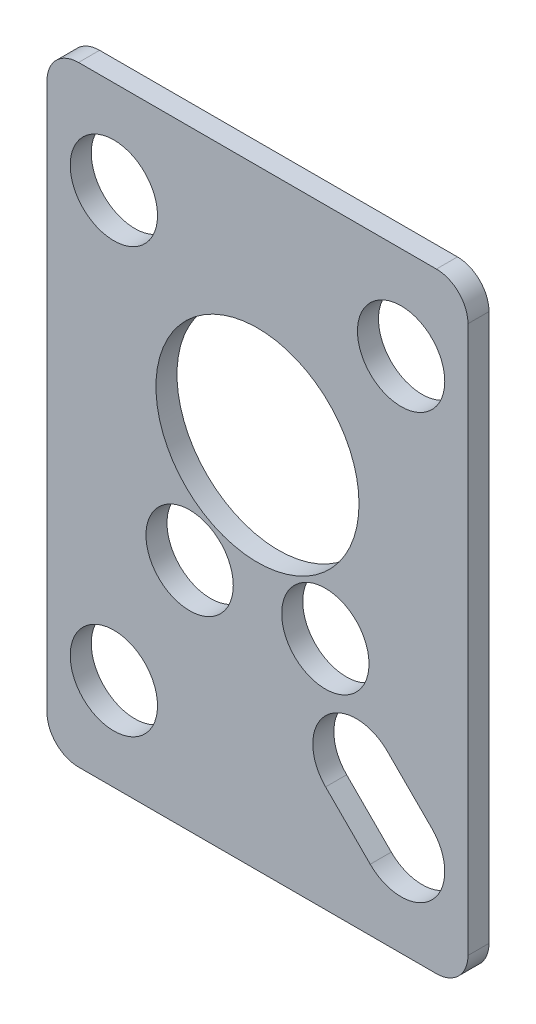
ISO-10303-21;
HEADER;
FILE_DESCRIPTION(('STEP AP214'),'2;1');
FILE_NAME('part.step','',(''),(''),'','','');
FILE_SCHEMA(('AUTOMOTIVE_DESIGN { 1 0 10303 214 1 1 1 1 }'));
ENDSEC;
DATA;
#1=APPLICATION_CONTEXT('core data for automotive mechanical design processes');
#2=APPLICATION_PROTOCOL_DEFINITION('international standard','automotive_design',2000,#1);
#3=PRODUCT_CONTEXT('',#1,'mechanical');
#4=PRODUCT('Part','Part','',(#3));
#5=PRODUCT_RELATED_PRODUCT_CATEGORY('part','',(#4));
#6=PRODUCT_DEFINITION_FORMATION('','',#4);
#7=PRODUCT_DEFINITION_CONTEXT('part definition',#1,'design');
#8=PRODUCT_DEFINITION('design','',#6,#7);
#9=PRODUCT_DEFINITION_SHAPE('','',#8);
#10=(LENGTH_UNIT() NAMED_UNIT(*) SI_UNIT(.MILLI.,.METRE.));
#11=(NAMED_UNIT(*) PLANE_ANGLE_UNIT() SI_UNIT($,.RADIAN.));
#12=(NAMED_UNIT(*) SI_UNIT($,.STERADIAN.) SOLID_ANGLE_UNIT());
#13=UNCERTAINTY_MEASURE_WITH_UNIT(LENGTH_MEASURE(1.E-05),#10,'distance_accuracy_value','');
#14=(GEOMETRIC_REPRESENTATION_CONTEXT(3) GLOBAL_UNCERTAINTY_ASSIGNED_CONTEXT((#13)) GLOBAL_UNIT_ASSIGNED_CONTEXT((#10,
#11,#12)) REPRESENTATION_CONTEXT('',''));
#15=CARTESIAN_POINT('',(0.,0.,0.));
#16=DIRECTION('',(0.,0.,1.));
#17=DIRECTION('',(1.,0.,0.));
#18=AXIS2_PLACEMENT_3D('',#15,#16,#17);
#19=CARTESIAN_POINT('',(-17.005,-26.,2.));
#20=DIRECTION('',(0.,0.,-1.));
#21=DIRECTION('',(-1.,0.,0.));
#22=AXIS2_PLACEMENT_3D('',#19,#20,#21);
#23=PLANE('',#22);
#24=CARTESIAN_POINT('',(-13.65,20.15,2.));
#25=DIRECTION('',(0.,0.,1.));
#26=DIRECTION('',(1.,0.,0.));
#27=AXIS2_PLACEMENT_3D('',#24,#25,#26);
#28=CIRCLE('',#27,4.15);
#29=CARTESIAN_POINT('',(-9.5,20.15,2.));
#30=VERTEX_POINT('',#29);
#31=EDGE_CURVE('E177',#30,#30,#28,.T.);
#32=ORIENTED_EDGE('',*,*,#31,.F.);
#33=EDGE_LOOP('',(#32));
#34=FACE_BOUND('',#33,.T.);
#35=CARTESIAN_POINT('',(-13.65,-20.2,2.));
#36=DIRECTION('',(0.,0.,1.));
#37=DIRECTION('',(1.,0.,0.));
#38=AXIS2_PLACEMENT_3D('',#35,#36,#37);
#39=CIRCLE('',#38,4.15);
#40=CARTESIAN_POINT('',(-9.5,-20.2,2.));
#41=VERTEX_POINT('',#40);
#42=EDGE_CURVE('E185',#41,#41,#39,.T.);
#43=ORIENTED_EDGE('',*,*,#42,.F.);
#44=EDGE_LOOP('',(#43));
#45=FACE_BOUND('',#44,.T.);
#46=CARTESIAN_POINT('',(-6.45,-6.70000000000002,2.));
#47=DIRECTION('',(0.,0.,1.));
#48=DIRECTION('',(1.,0.,0.));
#49=AXIS2_PLACEMENT_3D('',#46,#47,#48);
#50=CIRCLE('',#49,4.15);
#51=CARTESIAN_POINT('',(-2.3,-6.70000000000002,2.));
#52=VERTEX_POINT('',#51);
#53=EDGE_CURVE('E193',#52,#52,#50,.T.);
#54=ORIENTED_EDGE('',*,*,#53,.F.);
#55=EDGE_LOOP('',(#54));
#56=FACE_BOUND('',#55,.T.);
#57=CARTESIAN_POINT('',(6.45,-6.70000000000002,2.));
#58=DIRECTION('',(0.,0.,1.));
#59=DIRECTION('',(1.,0.,0.));
#60=AXIS2_PLACEMENT_3D('',#57,#58,#59);
#61=CIRCLE('',#60,4.15);
#62=CARTESIAN_POINT('',(10.6,-6.70000000000002,2.));
#63=VERTEX_POINT('',#62);
#64=EDGE_CURVE('E201',#63,#63,#61,.T.);
#65=ORIENTED_EDGE('',*,*,#64,.F.);
#66=EDGE_LOOP('',(#65));
#67=FACE_BOUND('',#66,.T.);
#68=CARTESIAN_POINT('',(13.65,20.15,2.));
#69=DIRECTION('',(0.,0.,1.));
#70=DIRECTION('',(1.,0.,0.));
#71=AXIS2_PLACEMENT_3D('',#68,#69,#70);
#72=CIRCLE('',#71,4.15);
#73=CARTESIAN_POINT('',(17.8,20.15,2.));
#74=VERTEX_POINT('',#73);
#75=EDGE_CURVE('E209',#74,#74,#72,.T.);
#76=ORIENTED_EDGE('',*,*,#75,.F.);
#77=EDGE_LOOP('',(#76));
#78=FACE_BOUND('',#77,.T.);
#79=CARTESIAN_POINT('',(0.,5.99999999999999,2.));
#80=DIRECTION('',(0.,0.,1.));
#81=DIRECTION('',(1.,0.,0.));
#82=AXIS2_PLACEMENT_3D('',#79,#80,#81);
#83=CIRCLE('',#82,9.65);
#84=CARTESIAN_POINT('',(9.65,5.99999999999999,2.));
#85=VERTEX_POINT('',#84);
#86=EDGE_CURVE('E217',#85,#85,#83,.T.);
#87=ORIENTED_EDGE('',*,*,#86,.F.);
#88=EDGE_LOOP('',(#87));
#89=FACE_BOUND('',#88,.T.);
#90=CARTESIAN_POINT('',(-17.005,-26.,2.));
#91=DIRECTION('',(0.,0.,1.));
#92=DIRECTION('',(-1.,0.,0.));
#93=AXIS2_PLACEMENT_3D('',#90,#91,#92);
#94=CIRCLE('',#93,3.);
#95=CARTESIAN_POINT('',(-20.005,-26.,2.));
#96=VERTEX_POINT('',#95);
#97=CARTESIAN_POINT('',(-17.005,-29.,2.));
#98=VERTEX_POINT('',#97);
#99=EDGE_CURVE('E225',#96,#98,#94,.T.);
#100=ORIENTED_EDGE('',*,*,#99,.T.);
#101=DIRECTION('',(1.,0.,0.));
#102=VECTOR('',#101,1.);
#103=CARTESIAN_POINT('',(17.005,-29.,2.));
#104=LINE('',#103,#102);
#105=CARTESIAN_POINT('',(17.005,-29.,2.));
#106=VERTEX_POINT('',#105);
#107=EDGE_CURVE('E229',#98,#106,#104,.T.);
#108=ORIENTED_EDGE('',*,*,#107,.T.);
#109=CARTESIAN_POINT('',(17.005,-26.,2.));
#110=DIRECTION('',(0.,0.,1.));
#111=DIRECTION('',(1.,0.,0.));
#112=AXIS2_PLACEMENT_3D('',#109,#110,#111);
#113=CIRCLE('',#112,3.);
#114=CARTESIAN_POINT('',(20.005,-26.,2.));
#115=VERTEX_POINT('',#114);
#116=EDGE_CURVE('E233',#106,#115,#113,.T.);
#117=ORIENTED_EDGE('',*,*,#116,.T.);
#118=DIRECTION('',(0.,1.,0.));
#119=VECTOR('',#118,1.);
#120=CARTESIAN_POINT('',(20.005,-26.,2.));
#121=LINE('',#120,#119);
#122=CARTESIAN_POINT('',(20.005,26.,2.));
#123=VERTEX_POINT('',#122);
#124=EDGE_CURVE('E236',#115,#123,#121,.T.);
#125=ORIENTED_EDGE('',*,*,#124,.T.);
#126=CARTESIAN_POINT('',(17.005,26.,2.));
#127=DIRECTION('',(0.,0.,1.));
#128=DIRECTION('',(1.,0.,0.));
#129=AXIS2_PLACEMENT_3D('',#126,#127,#128);
#130=CIRCLE('',#129,3.);
#131=CARTESIAN_POINT('',(17.005,29.,2.));
#132=VERTEX_POINT('',#131);
#133=EDGE_CURVE('E239',#123,#132,#130,.T.);
#134=ORIENTED_EDGE('',*,*,#133,.T.);
#135=DIRECTION('',(-1.,0.,0.));
#136=VECTOR('',#135,1.);
#137=CARTESIAN_POINT('',(17.005,29.,2.));
#138=LINE('',#137,#136);
#139=CARTESIAN_POINT('',(-17.005,29.,2.));
#140=VERTEX_POINT('',#139);
#141=EDGE_CURVE('E242',#132,#140,#138,.T.);
#142=ORIENTED_EDGE('',*,*,#141,.T.);
#143=CARTESIAN_POINT('',(-17.005,26.,2.));
#144=DIRECTION('',(0.,0.,1.));
#145=DIRECTION('',(1.,0.,0.));
#146=AXIS2_PLACEMENT_3D('',#143,#144,#145);
#147=CIRCLE('',#146,3.);
#148=CARTESIAN_POINT('',(-20.005,26.,2.));
#149=VERTEX_POINT('',#148);
#150=EDGE_CURVE('E245',#140,#149,#147,.T.);
#151=ORIENTED_EDGE('',*,*,#150,.T.);
#152=DIRECTION('',(0.,-1.,0.));
#153=VECTOR('',#152,1.);
#154=CARTESIAN_POINT('',(-20.005,-26.,2.));
#155=LINE('',#154,#153);
#156=EDGE_CURVE('E248',#149,#96,#155,.T.);
#157=ORIENTED_EDGE('',*,*,#156,.T.);
#158=EDGE_LOOP('',(#100,#108,#117,#125,#134,#142,#151,#157));
#159=FACE_BOUND('',#158,.T.);
#160=CARTESIAN_POINT('',(13.65,-20.2,2.));
#161=DIRECTION('',(0.,0.,1.));
#162=DIRECTION('',(1.,0.,0.));
#163=AXIS2_PLACEMENT_3D('',#160,#161,#162);
#164=CIRCLE('',#163,4.15);
#165=CARTESIAN_POINT('',(10.7155068580758,-23.1344931419242,2.));
#166=VERTEX_POINT('',#165);
#167=CARTESIAN_POINT('',(16.5844931419242,-17.2655068580758,2.));
#168=VERTEX_POINT('',#167);
#169=EDGE_CURVE('E129',#166,#168,#164,.T.);
#170=ORIENTED_EDGE('',*,*,#169,.F.);
#171=DIRECTION('',(0.707106781186551,-0.707106781186544,0.));
#172=VECTOR('',#171,1.);
#173=CARTESIAN_POINT('',(10.7155068580758,-23.1344931419242,2.));
#174=LINE('',#173,#172);
#175=CARTESIAN_POINT('',(6.47286617095654,-18.8918524548049,2.));
#176=VERTEX_POINT('',#175);
#177=EDGE_CURVE('E155',#176,#166,#174,.T.);
#178=ORIENTED_EDGE('',*,*,#177,.F.);
#179=CARTESIAN_POINT('',(9.4073593128807,-15.9573593128807,2.));
#180=DIRECTION('',(0.,0.,1.));
#181=DIRECTION('',(1.,0.,0.));
#182=AXIS2_PLACEMENT_3D('',#179,#180,#181);
#183=CIRCLE('',#182,4.15);
#184=CARTESIAN_POINT('',(12.3418524548049,-13.0228661709566,2.));
#185=VERTEX_POINT('',#184);
#186=EDGE_CURVE('E151',#185,#176,#183,.T.);
#187=ORIENTED_EDGE('',*,*,#186,.F.);
#188=DIRECTION('',(-0.70710678118655,0.707106781186545,0.));
#189=VECTOR('',#188,1.);
#190=CARTESIAN_POINT('',(16.5844931419242,-17.2655068580758,2.));
#191=LINE('',#190,#189);
#192=EDGE_CURVE('E138',#168,#185,#191,.T.);
#193=ORIENTED_EDGE('',*,*,#192,.F.);
#194=EDGE_LOOP('',(#170,#178,#187,#193));
#195=FACE_BOUND('',#194,.T.);
#196=ADVANCED_FACE('F39',(#34,#45,#56,#67,#78,#89,#159,#195),#23,.F.);
#197=CARTESIAN_POINT('',(-17.005,-26.,0.));
#198=DIRECTION('',(0.,0.,-1.));
#199=DIRECTION('',(-1.,0.,0.));
#200=AXIS2_PLACEMENT_3D('',#197,#198,#199);
#201=PLANE('',#200);
#202=CARTESIAN_POINT('',(-13.65,-20.2,0.));
#203=DIRECTION('',(0.,0.,1.));
#204=DIRECTION('',(1.,0.,0.));
#205=AXIS2_PLACEMENT_3D('',#202,#203,#204);
#206=CIRCLE('',#205,4.15);
#207=CARTESIAN_POINT('',(-9.5,-20.2,0.));
#208=VERTEX_POINT('',#207);
#209=EDGE_CURVE('E181',#208,#208,#206,.T.);
#210=ORIENTED_EDGE('',*,*,#209,.T.);
#211=EDGE_LOOP('',(#210));
#212=FACE_BOUND('',#211,.T.);
#213=CARTESIAN_POINT('',(6.45,-6.70000000000002,0.));
#214=DIRECTION('',(0.,0.,1.));
#215=DIRECTION('',(1.,0.,0.));
#216=AXIS2_PLACEMENT_3D('',#213,#214,#215);
#217=CIRCLE('',#216,4.15);
#218=CARTESIAN_POINT('',(10.6,-6.70000000000002,0.));
#219=VERTEX_POINT('',#218);
#220=EDGE_CURVE('E197',#219,#219,#217,.T.);
#221=ORIENTED_EDGE('',*,*,#220,.T.);
#222=EDGE_LOOP('',(#221));
#223=FACE_BOUND('',#222,.T.);
#224=CARTESIAN_POINT('',(0.,5.99999999999999,0.));
#225=DIRECTION('',(0.,0.,1.));
#226=DIRECTION('',(1.,0.,0.));
#227=AXIS2_PLACEMENT_3D('',#224,#225,#226);
#228=CIRCLE('',#227,9.65);
#229=CARTESIAN_POINT('',(9.65,5.99999999999999,0.));
#230=VERTEX_POINT('',#229);
#231=EDGE_CURVE('E213',#230,#230,#228,.T.);
#232=ORIENTED_EDGE('',*,*,#231,.T.);
#233=EDGE_LOOP('',(#232));
#234=FACE_BOUND('',#233,.T.);
#235=CARTESIAN_POINT('',(-17.005,-26.,0.));
#236=DIRECTION('',(0.,0.,1.));
#237=DIRECTION('',(-1.,0.,0.));
#238=AXIS2_PLACEMENT_3D('',#235,#236,#237);
#239=CIRCLE('',#238,3.);
#240=CARTESIAN_POINT('',(-20.005,-26.,0.));
#241=VERTEX_POINT('',#240);
#242=CARTESIAN_POINT('',(-17.005,-29.,0.));
#243=VERTEX_POINT('',#242);
#244=EDGE_CURVE('E221',#241,#243,#239,.T.);
#245=ORIENTED_EDGE('',*,*,#244,.F.);
#246=DIRECTION('',(0.,-1.,0.));
#247=VECTOR('',#246,1.);
#248=CARTESIAN_POINT('',(-20.005,-26.,0.));
#249=LINE('',#248,#247);
#250=CARTESIAN_POINT('',(-20.005,26.,0.));
#251=VERTEX_POINT('',#250);
#252=EDGE_CURVE('E230',#251,#241,#249,.T.);
#253=ORIENTED_EDGE('',*,*,#252,.F.);
#254=CARTESIAN_POINT('',(-17.005,26.,0.));
#255=DIRECTION('',(0.,0.,1.));
#256=DIRECTION('',(1.,0.,0.));
#257=AXIS2_PLACEMENT_3D('',#254,#255,#256);
#258=CIRCLE('',#257,3.);
#259=CARTESIAN_POINT('',(-17.005,29.,0.));
#260=VERTEX_POINT('',#259);
#261=EDGE_CURVE('E270',#260,#251,#258,.T.);
#262=ORIENTED_EDGE('',*,*,#261,.F.);
#263=DIRECTION('',(-1.,0.,0.));
#264=VECTOR('',#263,1.);
#265=CARTESIAN_POINT('',(17.005,29.,0.));
#266=LINE('',#265,#264);
#267=CARTESIAN_POINT('',(17.005,29.,0.));
#268=VERTEX_POINT('',#267);
#269=EDGE_CURVE('E267',#268,#260,#266,.T.);
#270=ORIENTED_EDGE('',*,*,#269,.F.);
#271=CARTESIAN_POINT('',(17.005,26.,0.));
#272=DIRECTION('',(0.,0.,1.));
#273=DIRECTION('',(1.,0.,0.));
#274=AXIS2_PLACEMENT_3D('',#271,#272,#273);
#275=CIRCLE('',#274,3.);
#276=CARTESIAN_POINT('',(20.005,26.,0.));
#277=VERTEX_POINT('',#276);
#278=EDGE_CURVE('E264',#277,#268,#275,.T.);
#279=ORIENTED_EDGE('',*,*,#278,.F.);
#280=DIRECTION('',(0.,1.,0.));
#281=VECTOR('',#280,1.);
#282=CARTESIAN_POINT('',(20.005,-26.,0.));
#283=LINE('',#282,#281);
#284=CARTESIAN_POINT('',(20.005,-26.,0.));
#285=VERTEX_POINT('',#284);
#286=EDGE_CURVE('E261',#285,#277,#283,.T.);
#287=ORIENTED_EDGE('',*,*,#286,.F.);
#288=CARTESIAN_POINT('',(17.005,-26.,0.));
#289=DIRECTION('',(0.,0.,1.));
#290=DIRECTION('',(1.,0.,0.));
#291=AXIS2_PLACEMENT_3D('',#288,#289,#290);
#292=CIRCLE('',#291,3.);
#293=CARTESIAN_POINT('',(17.005,-29.,0.));
#294=VERTEX_POINT('',#293);
#295=EDGE_CURVE('E258',#294,#285,#292,.T.);
#296=ORIENTED_EDGE('',*,*,#295,.F.);
#297=DIRECTION('',(1.,0.,0.));
#298=VECTOR('',#297,1.);
#299=CARTESIAN_POINT('',(17.005,-29.,0.));
#300=LINE('',#299,#298);
#301=EDGE_CURVE('E255',#243,#294,#300,.T.);
#302=ORIENTED_EDGE('',*,*,#301,.F.);
#303=EDGE_LOOP('',(#245,#253,#262,#270,#279,#287,#296,#302));
#304=FACE_BOUND('',#303,.T.);
#305=CARTESIAN_POINT('',(13.65,20.15,0.));
#306=DIRECTION('',(0.,0.,1.));
#307=DIRECTION('',(1.,0.,0.));
#308=AXIS2_PLACEMENT_3D('',#305,#306,#307);
#309=CIRCLE('',#308,4.15);
#310=CARTESIAN_POINT('',(17.8,20.15,0.));
#311=VERTEX_POINT('',#310);
#312=EDGE_CURVE('E205',#311,#311,#309,.T.);
#313=ORIENTED_EDGE('',*,*,#312,.T.);
#314=EDGE_LOOP('',(#313));
#315=FACE_BOUND('',#314,.T.);
#316=CARTESIAN_POINT('',(-6.45,-6.70000000000002,0.));
#317=DIRECTION('',(0.,0.,1.));
#318=DIRECTION('',(1.,0.,0.));
#319=AXIS2_PLACEMENT_3D('',#316,#317,#318);
#320=CIRCLE('',#319,4.15);
#321=CARTESIAN_POINT('',(-2.3,-6.70000000000002,0.));
#322=VERTEX_POINT('',#321);
#323=EDGE_CURVE('E189',#322,#322,#320,.T.);
#324=ORIENTED_EDGE('',*,*,#323,.T.);
#325=EDGE_LOOP('',(#324));
#326=FACE_BOUND('',#325,.T.);
#327=CARTESIAN_POINT('',(-13.65,20.15,0.));
#328=DIRECTION('',(0.,0.,1.));
#329=DIRECTION('',(1.,0.,0.));
#330=AXIS2_PLACEMENT_3D('',#327,#328,#329);
#331=CIRCLE('',#330,4.15);
#332=CARTESIAN_POINT('',(-9.5,20.15,0.));
#333=VERTEX_POINT('',#332);
#334=EDGE_CURVE('E147',#333,#333,#331,.T.);
#335=ORIENTED_EDGE('',*,*,#334,.T.);
#336=EDGE_LOOP('',(#335));
#337=FACE_BOUND('',#336,.T.);
#338=DIRECTION('',(0.707106781186551,-0.707106781186544,0.));
#339=VECTOR('',#338,1.);
#340=CARTESIAN_POINT('',(10.7155068580758,-23.1344931419242,0.));
#341=LINE('',#340,#339);
#342=CARTESIAN_POINT('',(6.47286617095654,-18.8918524548049,0.));
#343=VERTEX_POINT('',#342);
#344=CARTESIAN_POINT('',(10.7155068580758,-23.1344931419242,0.));
#345=VERTEX_POINT('',#344);
#346=EDGE_CURVE('E139',#343,#345,#341,.T.);
#347=ORIENTED_EDGE('',*,*,#346,.T.);
#348=CARTESIAN_POINT('',(13.65,-20.2,0.));
#349=DIRECTION('',(0.,0.,1.));
#350=DIRECTION('',(1.,0.,0.));
#351=AXIS2_PLACEMENT_3D('',#348,#349,#350);
#352=CIRCLE('',#351,4.15);
#353=CARTESIAN_POINT('',(16.5844931419242,-17.2655068580758,0.));
#354=VERTEX_POINT('',#353);
#355=EDGE_CURVE('E63',#345,#354,#352,.T.);
#356=ORIENTED_EDGE('',*,*,#355,.T.);
#357=DIRECTION('',(-0.70710678118655,0.707106781186545,0.));
#358=VECTOR('',#357,1.);
#359=CARTESIAN_POINT('',(16.5844931419242,-17.2655068580758,0.));
#360=LINE('',#359,#358);
#361=CARTESIAN_POINT('',(12.3418524548049,-13.0228661709566,0.));
#362=VERTEX_POINT('',#361);
#363=EDGE_CURVE('E145',#354,#362,#360,.T.);
#364=ORIENTED_EDGE('',*,*,#363,.T.);
#365=CARTESIAN_POINT('',(9.4073593128807,-15.9573593128807,0.));
#366=DIRECTION('',(0.,0.,1.));
#367=DIRECTION('',(1.,0.,0.));
#368=AXIS2_PLACEMENT_3D('',#365,#366,#367);
#369=CIRCLE('',#368,4.15);
#370=EDGE_CURVE('E164',#362,#343,#369,.T.);
#371=ORIENTED_EDGE('',*,*,#370,.T.);
#372=EDGE_LOOP('',(#347,#356,#364,#371));
#373=FACE_BOUND('',#372,.T.);
#374=ADVANCED_FACE('F309',(#212,#223,#234,#304,#315,#326,#337,#373),#201,.T.);
#375=CARTESIAN_POINT('',(-17.005,-26.,2.));
#376=DIRECTION('',(0.,0.,-1.));
#377=DIRECTION('',(-1.,0.,0.));
#378=AXIS2_PLACEMENT_3D('',#375,#376,#377);
#379=CYLINDRICAL_SURFACE('',#378,3.);
#380=ORIENTED_EDGE('',*,*,#244,.T.);
#381=DIRECTION('',(0.,0.,-1.));
#382=VECTOR('',#381,1.);
#383=CARTESIAN_POINT('',(-17.005,-29.,2.));
#384=LINE('',#383,#382);
#385=EDGE_CURVE('E11',#98,#243,#384,.T.);
#386=ORIENTED_EDGE('',*,*,#385,.F.);
#387=ORIENTED_EDGE('',*,*,#99,.F.);
#388=DIRECTION('',(0.,0.,-1.));
#389=VECTOR('',#388,1.);
#390=CARTESIAN_POINT('',(-20.005,-26.,2.));
#391=LINE('',#390,#389);
#392=EDGE_CURVE('E251',#96,#241,#391,.T.);
#393=ORIENTED_EDGE('',*,*,#392,.T.);
#394=EDGE_LOOP('',(#380,#386,#387,#393));
#395=FACE_BOUND('',#394,.T.);
#396=ADVANCED_FACE('F41',(#395),#379,.T.);
#397=CARTESIAN_POINT('',(17.005,-29.,2.));
#398=DIRECTION('',(0.,1.,0.));
#399=DIRECTION('',(0.,0.,1.));
#400=AXIS2_PLACEMENT_3D('',#397,#398,#399);
#401=PLANE('',#400);
#402=ORIENTED_EDGE('',*,*,#301,.T.);
#403=DIRECTION('',(0.,0.,-1.));
#404=VECTOR('',#403,1.);
#405=CARTESIAN_POINT('',(17.005,-29.,2.));
#406=LINE('',#405,#404);
#407=EDGE_CURVE('E48',#106,#294,#406,.T.);
#408=ORIENTED_EDGE('',*,*,#407,.F.);
#409=ORIENTED_EDGE('',*,*,#107,.F.);
#410=ORIENTED_EDGE('',*,*,#385,.T.);
#411=EDGE_LOOP('',(#402,#408,#409,#410));
#412=FACE_BOUND('',#411,.T.);
#413=ADVANCED_FACE('F326',(#412),#401,.F.);
#414=CARTESIAN_POINT('',(17.005,-26.,2.));
#415=DIRECTION('',(0.,0.,-1.));
#416=DIRECTION('',(-1.,0.,0.));
#417=AXIS2_PLACEMENT_3D('',#414,#415,#416);
#418=CYLINDRICAL_SURFACE('',#417,3.);
#419=ORIENTED_EDGE('',*,*,#295,.T.);
#420=DIRECTION('',(0.,0.,-1.));
#421=VECTOR('',#420,1.);
#422=CARTESIAN_POINT('',(20.005,-26.,2.));
#423=LINE('',#422,#421);
#424=EDGE_CURVE('E294',#115,#285,#423,.T.);
#425=ORIENTED_EDGE('',*,*,#424,.F.);
#426=ORIENTED_EDGE('',*,*,#116,.F.);
#427=ORIENTED_EDGE('',*,*,#407,.T.);
#428=EDGE_LOOP('',(#419,#425,#426,#427));
#429=FACE_BOUND('',#428,.T.);
#430=ADVANCED_FACE('F303',(#429),#418,.T.);
#431=CARTESIAN_POINT('',(20.005,-26.,2.));
#432=DIRECTION('',(-1.,0.,0.));
#433=DIRECTION('',(0.,0.,1.));
#434=AXIS2_PLACEMENT_3D('',#431,#432,#433);
#435=PLANE('',#434);
#436=ORIENTED_EDGE('',*,*,#286,.T.);
#437=DIRECTION('',(0.,0.,-1.));
#438=VECTOR('',#437,1.);
#439=CARTESIAN_POINT('',(20.005,26.,2.));
#440=LINE('',#439,#438);
#441=EDGE_CURVE('E290',#123,#277,#440,.T.);
#442=ORIENTED_EDGE('',*,*,#441,.F.);
#443=ORIENTED_EDGE('',*,*,#124,.F.);
#444=ORIENTED_EDGE('',*,*,#424,.T.);
#445=EDGE_LOOP('',(#436,#442,#443,#444));
#446=FACE_BOUND('',#445,.T.);
#447=ADVANCED_FACE('F315',(#446),#435,.F.);
#448=CARTESIAN_POINT('',(17.005,26.,2.));
#449=DIRECTION('',(0.,0.,-1.));
#450=DIRECTION('',(-1.,0.,0.));
#451=AXIS2_PLACEMENT_3D('',#448,#449,#450);
#452=CYLINDRICAL_SURFACE('',#451,3.);
#453=ORIENTED_EDGE('',*,*,#278,.T.);
#454=DIRECTION('',(0.,0.,-1.));
#455=VECTOR('',#454,1.);
#456=CARTESIAN_POINT('',(17.005,29.,2.));
#457=LINE('',#456,#455);
#458=EDGE_CURVE('E286',#132,#268,#457,.T.);
#459=ORIENTED_EDGE('',*,*,#458,.F.);
#460=ORIENTED_EDGE('',*,*,#133,.F.);
#461=ORIENTED_EDGE('',*,*,#441,.T.);
#462=EDGE_LOOP('',(#453,#459,#460,#461));
#463=FACE_BOUND('',#462,.T.);
#464=ADVANCED_FACE('F319',(#463),#452,.T.);
#465=CARTESIAN_POINT('',(17.005,29.,2.));
#466=DIRECTION('',(0.,-1.,0.));
#467=DIRECTION('',(0.,0.,-1.));
#468=AXIS2_PLACEMENT_3D('',#465,#466,#467);
#469=PLANE('',#468);
#470=ORIENTED_EDGE('',*,*,#269,.T.);
#471=DIRECTION('',(0.,0.,-1.));
#472=VECTOR('',#471,1.);
#473=CARTESIAN_POINT('',(-17.005,29.,2.));
#474=LINE('',#473,#472);
#475=EDGE_CURVE('E282',#140,#260,#474,.T.);
#476=ORIENTED_EDGE('',*,*,#475,.F.);
#477=ORIENTED_EDGE('',*,*,#141,.F.);
#478=ORIENTED_EDGE('',*,*,#458,.T.);
#479=EDGE_LOOP('',(#470,#476,#477,#478));
#480=FACE_BOUND('',#479,.T.);
#481=ADVANCED_FACE('F339',(#480),#469,.F.);
#482=CARTESIAN_POINT('',(-17.005,26.,2.));
#483=DIRECTION('',(0.,0.,-1.));
#484=DIRECTION('',(-1.,0.,0.));
#485=AXIS2_PLACEMENT_3D('',#482,#483,#484);
#486=CYLINDRICAL_SURFACE('',#485,3.);
#487=ORIENTED_EDGE('',*,*,#261,.T.);
#488=DIRECTION('',(0.,0.,-1.));
#489=VECTOR('',#488,1.);
#490=CARTESIAN_POINT('',(-20.005,26.,2.));
#491=LINE('',#490,#489);
#492=EDGE_CURVE('E278',#149,#251,#491,.T.);
#493=ORIENTED_EDGE('',*,*,#492,.F.);
#494=ORIENTED_EDGE('',*,*,#150,.F.);
#495=ORIENTED_EDGE('',*,*,#475,.T.);
#496=EDGE_LOOP('',(#487,#493,#494,#495));
#497=FACE_BOUND('',#496,.T.);
#498=ADVANCED_FACE('F337',(#497),#486,.T.);
#499=CARTESIAN_POINT('',(-20.005,-26.,2.));
#500=DIRECTION('',(1.,0.,0.));
#501=DIRECTION('',(0.,0.,-1.));
#502=AXIS2_PLACEMENT_3D('',#499,#500,#501);
#503=PLANE('',#502);
#504=ORIENTED_EDGE('',*,*,#252,.T.);
#505=ORIENTED_EDGE('',*,*,#392,.F.);
#506=ORIENTED_EDGE('',*,*,#156,.F.);
#507=ORIENTED_EDGE('',*,*,#492,.T.);
#508=EDGE_LOOP('',(#504,#505,#506,#507));
#509=FACE_BOUND('',#508,.T.);
#510=ADVANCED_FACE('F332',(#509),#503,.F.);
#511=CARTESIAN_POINT('',(0.,5.99999999999999,2.));
#512=DIRECTION('',(0.,0.,-1.));
#513=DIRECTION('',(-1.,0.,0.));
#514=AXIS2_PLACEMENT_3D('',#511,#512,#513);
#515=CYLINDRICAL_SURFACE('',#514,9.65);
#516=ORIENTED_EDGE('',*,*,#86,.T.);
#517=EDGE_LOOP('',(#516));
#518=FACE_BOUND('',#517,.T.);
#519=ORIENTED_EDGE('',*,*,#231,.F.);
#520=EDGE_LOOP('',(#519));
#521=FACE_BOUND('',#520,.T.);
#522=ADVANCED_FACE('F359',(#518,#521),#515,.F.);
#523=CARTESIAN_POINT('',(13.65,20.15,2.));
#524=DIRECTION('',(0.,0.,-1.));
#525=DIRECTION('',(-1.,0.,0.));
#526=AXIS2_PLACEMENT_3D('',#523,#524,#525);
#527=CYLINDRICAL_SURFACE('',#526,4.15);
#528=ORIENTED_EDGE('',*,*,#75,.T.);
#529=EDGE_LOOP('',(#528));
#530=FACE_BOUND('',#529,.T.);
#531=ORIENTED_EDGE('',*,*,#312,.F.);
#532=EDGE_LOOP('',(#531));
#533=FACE_BOUND('',#532,.T.);
#534=ADVANCED_FACE('F366',(#530,#533),#527,.F.);
#535=CARTESIAN_POINT('',(6.45,-6.70000000000002,2.));
#536=DIRECTION('',(0.,0.,-1.));
#537=DIRECTION('',(-1.,0.,0.));
#538=AXIS2_PLACEMENT_3D('',#535,#536,#537);
#539=CYLINDRICAL_SURFACE('',#538,4.15);
#540=ORIENTED_EDGE('',*,*,#64,.T.);
#541=EDGE_LOOP('',(#540));
#542=FACE_BOUND('',#541,.T.);
#543=ORIENTED_EDGE('',*,*,#220,.F.);
#544=EDGE_LOOP('',(#543));
#545=FACE_BOUND('',#544,.T.);
#546=ADVANCED_FACE('F371',(#542,#545),#539,.F.);
#547=CARTESIAN_POINT('',(-6.45,-6.70000000000002,2.));
#548=DIRECTION('',(0.,0.,-1.));
#549=DIRECTION('',(-1.,0.,0.));
#550=AXIS2_PLACEMENT_3D('',#547,#548,#549);
#551=CYLINDRICAL_SURFACE('',#550,4.15);
#552=ORIENTED_EDGE('',*,*,#53,.T.);
#553=EDGE_LOOP('',(#552));
#554=FACE_BOUND('',#553,.T.);
#555=ORIENTED_EDGE('',*,*,#323,.F.);
#556=EDGE_LOOP('',(#555));
#557=FACE_BOUND('',#556,.T.);
#558=ADVANCED_FACE('F381',(#554,#557),#551,.F.);
#559=CARTESIAN_POINT('',(-13.65,-20.2,2.));
#560=DIRECTION('',(0.,0.,-1.));
#561=DIRECTION('',(-1.,0.,0.));
#562=AXIS2_PLACEMENT_3D('',#559,#560,#561);
#563=CYLINDRICAL_SURFACE('',#562,4.15);
#564=ORIENTED_EDGE('',*,*,#42,.T.);
#565=EDGE_LOOP('',(#564));
#566=FACE_BOUND('',#565,.T.);
#567=ORIENTED_EDGE('',*,*,#209,.F.);
#568=EDGE_LOOP('',(#567));
#569=FACE_BOUND('',#568,.T.);
#570=ADVANCED_FACE('F388',(#566,#569),#563,.F.);
#571=CARTESIAN_POINT('',(-13.65,20.15,2.));
#572=DIRECTION('',(0.,0.,-1.));
#573=DIRECTION('',(-1.,0.,0.));
#574=AXIS2_PLACEMENT_3D('',#571,#572,#573);
#575=CYLINDRICAL_SURFACE('',#574,4.15);
#576=ORIENTED_EDGE('',*,*,#31,.T.);
#577=EDGE_LOOP('',(#576));
#578=FACE_BOUND('',#577,.T.);
#579=ORIENTED_EDGE('',*,*,#334,.F.);
#580=EDGE_LOOP('',(#579));
#581=FACE_BOUND('',#580,.T.);
#582=ADVANCED_FACE('F392',(#578,#581),#575,.F.);
#583=CARTESIAN_POINT('',(13.65,-20.2,2.));
#584=DIRECTION('',(0.,0.,-1.));
#585=DIRECTION('',(-1.,0.,0.));
#586=AXIS2_PLACEMENT_3D('',#583,#584,#585);
#587=CYLINDRICAL_SURFACE('',#586,4.15);
#588=ORIENTED_EDGE('',*,*,#355,.F.);
#589=DIRECTION('',(0.,0.,-1.));
#590=VECTOR('',#589,1.);
#591=CARTESIAN_POINT('',(10.7155068580758,-23.1344931419242,2.));
#592=LINE('',#591,#590);
#593=EDGE_CURVE('E133',#166,#345,#592,.T.);
#594=ORIENTED_EDGE('',*,*,#593,.F.);
#595=ORIENTED_EDGE('',*,*,#169,.T.);
#596=DIRECTION('',(0.,0.,-1.));
#597=VECTOR('',#596,1.);
#598=CARTESIAN_POINT('',(16.5844931419242,-17.2655068580758,2.));
#599=LINE('',#598,#597);
#600=EDGE_CURVE('E132',#168,#354,#599,.T.);
#601=ORIENTED_EDGE('',*,*,#600,.T.);
#602=EDGE_LOOP('',(#588,#594,#595,#601));
#603=FACE_BOUND('',#602,.T.);
#604=ADVANCED_FACE('F131',(#603),#587,.F.);
#605=CARTESIAN_POINT('',(16.5844931419242,-17.2655068580758,2.));
#606=DIRECTION('',(-0.707106781186545,-0.70710678118655,0.));
#607=DIRECTION('',(0.70710678118655,-0.707106781186545,0.));
#608=AXIS2_PLACEMENT_3D('',#605,#606,#607);
#609=PLANE('',#608);
#610=ORIENTED_EDGE('',*,*,#363,.F.);
#611=ORIENTED_EDGE('',*,*,#600,.F.);
#612=ORIENTED_EDGE('',*,*,#192,.T.);
#613=DIRECTION('',(0.,0.,-1.));
#614=VECTOR('',#613,1.);
#615=CARTESIAN_POINT('',(12.3418524548049,-13.0228661709566,2.));
#616=LINE('',#615,#614);
#617=EDGE_CURVE('E148',#185,#362,#616,.T.);
#618=ORIENTED_EDGE('',*,*,#617,.T.);
#619=EDGE_LOOP('',(#610,#611,#612,#618));
#620=FACE_BOUND('',#619,.T.);
#621=ADVANCED_FACE('F142',(#620),#609,.T.);
#622=CARTESIAN_POINT('',(9.4073593128807,-15.9573593128807,2.));
#623=DIRECTION('',(0.,0.,-1.));
#624=DIRECTION('',(-1.,0.,0.));
#625=AXIS2_PLACEMENT_3D('',#622,#623,#624);
#626=CYLINDRICAL_SURFACE('',#625,4.15);
#627=ORIENTED_EDGE('',*,*,#370,.F.);
#628=ORIENTED_EDGE('',*,*,#617,.F.);
#629=ORIENTED_EDGE('',*,*,#186,.T.);
#630=DIRECTION('',(0.,0.,-1.));
#631=VECTOR('',#630,1.);
#632=CARTESIAN_POINT('',(6.47286617095654,-18.8918524548049,2.));
#633=LINE('',#632,#631);
#634=EDGE_CURVE('E55',#176,#343,#633,.T.);
#635=ORIENTED_EDGE('',*,*,#634,.T.);
#636=EDGE_LOOP('',(#627,#628,#629,#635));
#637=FACE_BOUND('',#636,.T.);
#638=ADVANCED_FACE('F401',(#637),#626,.F.);
#639=CARTESIAN_POINT('',(10.7155068580758,-23.1344931419242,2.));
#640=DIRECTION('',(0.707106781186544,0.707106781186551,0.));
#641=DIRECTION('',(-0.707106781186551,0.707106781186544,0.));
#642=AXIS2_PLACEMENT_3D('',#639,#640,#641);
#643=PLANE('',#642);
#644=ORIENTED_EDGE('',*,*,#346,.F.);
#645=ORIENTED_EDGE('',*,*,#634,.F.);
#646=ORIENTED_EDGE('',*,*,#177,.T.);
#647=ORIENTED_EDGE('',*,*,#593,.T.);
#648=EDGE_LOOP('',(#644,#645,#646,#647));
#649=FACE_BOUND('',#648,.T.);
#650=ADVANCED_FACE('F404',(#649),#643,.T.);
#651=CLOSED_SHELL('',(#196,#374,#396,#413,#430,#447,#464,#481,#498,#510,#522,#534,#546,#558,
#570,#582,#604,#621,#638,#650));
#652=MANIFOLD_SOLID_BREP('B2',#651);
#653=ADVANCED_BREP_SHAPE_REPRESENTATION('',(#18,#652),#14);
#654=SHAPE_DEFINITION_REPRESENTATION(#9,#653);
ENDSEC;
END-ISO-10303-21;
